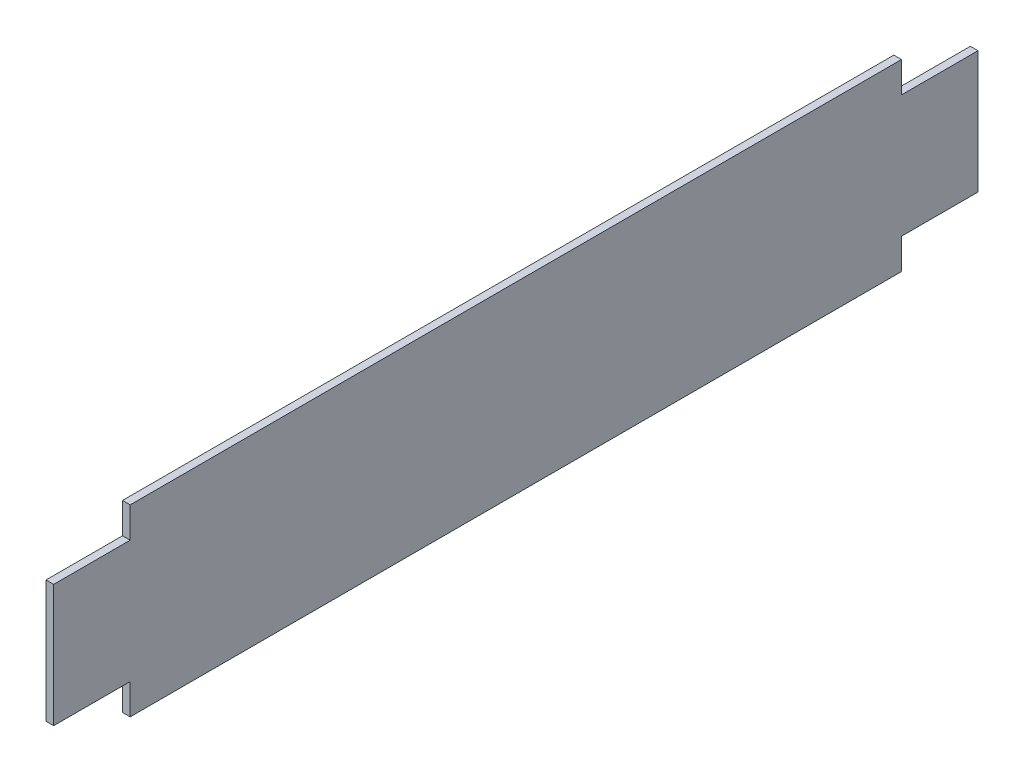
ISO-10303-21;
HEADER;
FILE_DESCRIPTION(('STEP AP214'),'2;1');
FILE_NAME('part.step','',(''),(''),'','','');
FILE_SCHEMA(('AUTOMOTIVE_DESIGN { 1 0 10303 214 1 1 1 1 }'));
ENDSEC;
DATA;
#1=APPLICATION_CONTEXT('core data for automotive mechanical design processes');
#2=APPLICATION_PROTOCOL_DEFINITION('international standard','automotive_design',2000,#1);
#3=PRODUCT_CONTEXT('',#1,'mechanical');
#4=PRODUCT('Part','Part','',(#3));
#5=PRODUCT_RELATED_PRODUCT_CATEGORY('part','',(#4));
#6=PRODUCT_DEFINITION_FORMATION('','',#4);
#7=PRODUCT_DEFINITION_CONTEXT('part definition',#1,'design');
#8=PRODUCT_DEFINITION('design','',#6,#7);
#9=PRODUCT_DEFINITION_SHAPE('','',#8);
#10=(LENGTH_UNIT() NAMED_UNIT(*) SI_UNIT(.MILLI.,.METRE.));
#11=(NAMED_UNIT(*) PLANE_ANGLE_UNIT() SI_UNIT($,.RADIAN.));
#12=(NAMED_UNIT(*) SI_UNIT($,.STERADIAN.) SOLID_ANGLE_UNIT());
#13=UNCERTAINTY_MEASURE_WITH_UNIT(LENGTH_MEASURE(1.E-05),#10,'distance_accuracy_value','');
#14=(GEOMETRIC_REPRESENTATION_CONTEXT(3) GLOBAL_UNCERTAINTY_ASSIGNED_CONTEXT((#13)) GLOBAL_UNIT_ASSIGNED_CONTEXT((#10,
#11,#12)) REPRESENTATION_CONTEXT('',''));
#15=CARTESIAN_POINT('',(0.,0.,0.));
#16=DIRECTION('',(0.,0.,1.));
#17=DIRECTION('',(1.,0.,0.));
#18=AXIS2_PLACEMENT_3D('',#15,#16,#17);
#19=CARTESIAN_POINT('',(0.,-25.4,191.77));
#20=DIRECTION('',(0.,1.,0.));
#21=DIRECTION('',(0.,0.,1.));
#22=AXIS2_PLACEMENT_3D('',#19,#20,#21);
#23=PLANE('',#22);
#24=DIRECTION('',(1.,0.,0.));
#25=VECTOR('',#24,1.);
#26=CARTESIAN_POINT('',(0.,-25.4,-160.02));
#27=LINE('',#26,#25);
#28=CARTESIAN_POINT('',(-1.5875,-25.4,-160.02));
#29=VERTEX_POINT('',#28);
#30=CARTESIAN_POINT('',(1.5875,-25.4,-160.02));
#31=VERTEX_POINT('',#30);
#32=EDGE_CURVE('E232',#29,#31,#27,.T.);
#33=ORIENTED_EDGE('',*,*,#32,.F.);
#34=DIRECTION('',(0.,0.,-1.));
#35=VECTOR('',#34,1.);
#36=CARTESIAN_POINT('',(-1.5875,-25.4,191.77));
#37=LINE('',#36,#35);
#38=CARTESIAN_POINT('',(-1.5875,-25.4,-191.77));
#39=VERTEX_POINT('',#38);
#40=EDGE_CURVE('E156',#29,#39,#37,.T.);
#41=ORIENTED_EDGE('',*,*,#40,.T.);
#42=DIRECTION('',(1.,0.,0.));
#43=VECTOR('',#42,1.);
#44=CARTESIAN_POINT('',(0.,-25.4,-191.77));
#45=LINE('',#44,#43);
#46=CARTESIAN_POINT('',(1.5875,-25.4,-191.77));
#47=VERTEX_POINT('',#46);
#48=EDGE_CURVE('E193',#39,#47,#45,.T.);
#49=ORIENTED_EDGE('',*,*,#48,.T.);
#50=DIRECTION('',(0.,0.,-1.));
#51=VECTOR('',#50,1.);
#52=CARTESIAN_POINT('',(1.5875,-25.4,191.77));
#53=LINE('',#52,#51);
#54=EDGE_CURVE('E180',#31,#47,#53,.T.);
#55=ORIENTED_EDGE('',*,*,#54,.F.);
#56=EDGE_LOOP('',(#33,#41,#49,#55));
#57=FACE_BOUND('',#56,.T.);
#58=ADVANCED_FACE('F42',(#57),#23,.F.);
#59=CARTESIAN_POINT('',(0.,25.4,191.77));
#60=DIRECTION('',(0.,1.,0.));
#61=DIRECTION('',(0.,0.,1.));
#62=AXIS2_PLACEMENT_3D('',#59,#60,#61);
#63=PLANE('',#62);
#64=DIRECTION('',(0.,0.,-1.));
#65=VECTOR('',#64,1.);
#66=CARTESIAN_POINT('',(-1.5875,25.4,191.77));
#67=LINE('',#66,#65);
#68=CARTESIAN_POINT('',(-1.5875,25.4,-160.02));
#69=VERTEX_POINT('',#68);
#70=CARTESIAN_POINT('',(-1.5875,25.4,-191.77));
#71=VERTEX_POINT('',#70);
#72=EDGE_CURVE('E155',#69,#71,#67,.T.);
#73=ORIENTED_EDGE('',*,*,#72,.F.);
#74=DIRECTION('',(1.,0.,0.));
#75=VECTOR('',#74,1.);
#76=CARTESIAN_POINT('',(0.,25.4,-160.02));
#77=LINE('',#76,#75);
#78=CARTESIAN_POINT('',(1.5875,25.4,-160.02));
#79=VERTEX_POINT('',#78);
#80=EDGE_CURVE('E66',#69,#79,#77,.T.);
#81=ORIENTED_EDGE('',*,*,#80,.T.);
#82=DIRECTION('',(0.,0.,-1.));
#83=VECTOR('',#82,1.);
#84=CARTESIAN_POINT('',(1.5875,25.4,191.77));
#85=LINE('',#84,#83);
#86=CARTESIAN_POINT('',(1.5875,25.4,-191.77));
#87=VERTEX_POINT('',#86);
#88=EDGE_CURVE('E51',#79,#87,#85,.T.);
#89=ORIENTED_EDGE('',*,*,#88,.T.);
#90=DIRECTION('',(1.,0.,0.));
#91=VECTOR('',#90,1.);
#92=CARTESIAN_POINT('',(0.,25.4,-191.77));
#93=LINE('',#92,#91);
#94=EDGE_CURVE('E173',#71,#87,#93,.T.);
#95=ORIENTED_EDGE('',*,*,#94,.F.);
#96=EDGE_LOOP('',(#73,#81,#89,#95));
#97=FACE_BOUND('',#96,.T.);
#98=ADVANCED_FACE('F171',(#97),#63,.T.);
#99=CARTESIAN_POINT('',(1.5875,0.,191.77));
#100=DIRECTION('',(1.,0.,0.));
#101=DIRECTION('',(0.,1.,0.));
#102=AXIS2_PLACEMENT_3D('',#99,#100,#101);
#103=PLANE('',#102);
#104=DIRECTION('',(0.,-1.,0.));
#105=VECTOR('',#104,1.);
#106=CARTESIAN_POINT('',(1.5875,0.,-191.77));
#107=LINE('',#106,#105);
#108=EDGE_CURVE('E178',#87,#47,#107,.T.);
#109=ORIENTED_EDGE('',*,*,#108,.F.);
#110=ORIENTED_EDGE('',*,*,#88,.F.);
#111=DIRECTION('',(0.,-1.,0.));
#112=VECTOR('',#111,1.);
#113=CARTESIAN_POINT('',(1.5875,0.,-160.02));
#114=LINE('',#113,#112);
#115=CARTESIAN_POINT('',(1.5875,38.1,-160.02));
#116=VERTEX_POINT('',#115);
#117=EDGE_CURVE('E242',#116,#79,#114,.T.);
#118=ORIENTED_EDGE('',*,*,#117,.F.);
#119=DIRECTION('',(0.,0.,-1.));
#120=VECTOR('',#119,1.);
#121=CARTESIAN_POINT('',(1.5875,38.1,160.02));
#122=LINE('',#121,#120);
#123=CARTESIAN_POINT('',(1.5875,38.1,160.02));
#124=VERTEX_POINT('',#123);
#125=EDGE_CURVE('E185',#124,#116,#122,.T.);
#126=ORIENTED_EDGE('',*,*,#125,.F.);
#127=DIRECTION('',(0.,-1.,0.));
#128=VECTOR('',#127,1.);
#129=CARTESIAN_POINT('',(1.5875,0.,160.02));
#130=LINE('',#129,#128);
#131=CARTESIAN_POINT('',(1.5875,25.4,160.02));
#132=VERTEX_POINT('',#131);
#133=EDGE_CURVE('E243',#124,#132,#130,.T.);
#134=ORIENTED_EDGE('',*,*,#133,.T.);
#135=CARTESIAN_POINT('',(1.5875,25.4,191.77));
#136=VERTEX_POINT('',#135);
#137=EDGE_CURVE('E11',#136,#132,#85,.T.);
#138=ORIENTED_EDGE('',*,*,#137,.F.);
#139=DIRECTION('',(0.,-1.,0.));
#140=VECTOR('',#139,1.);
#141=CARTESIAN_POINT('',(1.5875,0.,191.77));
#142=LINE('',#141,#140);
#143=CARTESIAN_POINT('',(1.5875,-25.4,191.77));
#144=VERTEX_POINT('',#143);
#145=EDGE_CURVE('E197',#136,#144,#142,.T.);
#146=ORIENTED_EDGE('',*,*,#145,.T.);
#147=CARTESIAN_POINT('',(1.5875,-25.4,160.02));
#148=VERTEX_POINT('',#147);
#149=EDGE_CURVE('E161',#144,#148,#53,.T.);
#150=ORIENTED_EDGE('',*,*,#149,.T.);
#151=DIRECTION('',(0.,-1.,0.));
#152=VECTOR('',#151,1.);
#153=CARTESIAN_POINT('',(1.5875,0.,160.02));
#154=LINE('',#153,#152);
#155=CARTESIAN_POINT('',(1.58750000000001,-38.1,160.02));
#156=VERTEX_POINT('',#155);
#157=EDGE_CURVE('E58',#148,#156,#154,.T.);
#158=ORIENTED_EDGE('',*,*,#157,.T.);
#159=DIRECTION('',(0.,0.,-1.));
#160=VECTOR('',#159,1.);
#161=CARTESIAN_POINT('',(1.58750000000001,-38.1,160.02));
#162=LINE('',#161,#160);
#163=CARTESIAN_POINT('',(1.58750000000001,-38.1,-160.02));
#164=VERTEX_POINT('',#163);
#165=EDGE_CURVE('E217',#156,#164,#162,.T.);
#166=ORIENTED_EDGE('',*,*,#165,.T.);
#167=DIRECTION('',(0.,-1.,0.));
#168=VECTOR('',#167,1.);
#169=CARTESIAN_POINT('',(1.5875,0.,-160.02));
#170=LINE('',#169,#168);
#171=EDGE_CURVE('E228',#31,#164,#170,.T.);
#172=ORIENTED_EDGE('',*,*,#171,.F.);
#173=ORIENTED_EDGE('',*,*,#54,.T.);
#174=EDGE_LOOP('',(#109,#110,#118,#126,#134,#138,#146,#150,#158,#166,#172,#173));
#175=FACE_BOUND('',#174,.T.);
#176=ADVANCED_FACE('F44',(#175),#103,.T.);
#177=DIRECTION('',(1.,0.,0.));
#178=VECTOR('',#177,1.);
#179=CARTESIAN_POINT('',(0.,25.4,160.02));
#180=LINE('',#179,#178);
#181=CARTESIAN_POINT('',(-1.5875,25.4,160.02));
#182=VERTEX_POINT('',#181);
#183=EDGE_CURVE('E254',#182,#132,#180,.T.);
#184=ORIENTED_EDGE('',*,*,#183,.F.);
#185=CARTESIAN_POINT('',(-1.5875,25.4,191.77));
#186=VERTEX_POINT('',#185);
#187=EDGE_CURVE('E160',#186,#182,#67,.T.);
#188=ORIENTED_EDGE('',*,*,#187,.F.);
#189=DIRECTION('',(1.,0.,0.));
#190=VECTOR('',#189,1.);
#191=CARTESIAN_POINT('',(0.,25.4,191.77));
#192=LINE('',#191,#190);
#193=EDGE_CURVE('E201',#186,#136,#192,.T.);
#194=ORIENTED_EDGE('',*,*,#193,.T.);
#195=ORIENTED_EDGE('',*,*,#137,.T.);
#196=EDGE_LOOP('',(#184,#188,#194,#195));
#197=FACE_BOUND('',#196,.T.);
#198=ADVANCED_FACE('F303',(#197),#63,.T.);
#199=CARTESIAN_POINT('',(-1.5875,0.,191.77));
#200=DIRECTION('',(1.,0.,0.));
#201=DIRECTION('',(0.,1.,0.));
#202=AXIS2_PLACEMENT_3D('',#199,#200,#201);
#203=PLANE('',#202);
#204=DIRECTION('',(0.,-1.,0.));
#205=VECTOR('',#204,1.);
#206=CARTESIAN_POINT('',(-1.5875,0.,-191.77));
#207=LINE('',#206,#205);
#208=EDGE_CURVE('E189',#71,#39,#207,.T.);
#209=ORIENTED_EDGE('',*,*,#208,.T.);
#210=ORIENTED_EDGE('',*,*,#40,.F.);
#211=DIRECTION('',(0.,-1.,0.));
#212=VECTOR('',#211,1.);
#213=CARTESIAN_POINT('',(-1.5875,0.,-160.02));
#214=LINE('',#213,#212);
#215=CARTESIAN_POINT('',(-1.5875,-38.1,-160.02));
#216=VERTEX_POINT('',#215);
#217=EDGE_CURVE('E223',#29,#216,#214,.T.);
#218=ORIENTED_EDGE('',*,*,#217,.T.);
#219=DIRECTION('',(0.,0.,-1.));
#220=VECTOR('',#219,1.);
#221=CARTESIAN_POINT('',(-1.5875,-38.1,160.02));
#222=LINE('',#221,#220);
#223=CARTESIAN_POINT('',(-1.5875,-38.1,160.02));
#224=VERTEX_POINT('',#223);
#225=EDGE_CURVE('E140',#224,#216,#222,.T.);
#226=ORIENTED_EDGE('',*,*,#225,.F.);
#227=DIRECTION('',(0.,-1.,0.));
#228=VECTOR('',#227,1.);
#229=CARTESIAN_POINT('',(-1.5875,0.,160.02));
#230=LINE('',#229,#228);
#231=CARTESIAN_POINT('',(-1.5875,-25.4,160.02));
#232=VERTEX_POINT('',#231);
#233=EDGE_CURVE('E132',#232,#224,#230,.T.);
#234=ORIENTED_EDGE('',*,*,#233,.F.);
#235=CARTESIAN_POINT('',(-1.5875,-25.4,191.77));
#236=VERTEX_POINT('',#235);
#237=EDGE_CURVE('E137',#236,#232,#37,.T.);
#238=ORIENTED_EDGE('',*,*,#237,.F.);
#239=DIRECTION('',(0.,-1.,0.));
#240=VECTOR('',#239,1.);
#241=CARTESIAN_POINT('',(-1.5875,0.,191.77));
#242=LINE('',#241,#240);
#243=EDGE_CURVE('E206',#186,#236,#242,.T.);
#244=ORIENTED_EDGE('',*,*,#243,.F.);
#245=ORIENTED_EDGE('',*,*,#187,.T.);
#246=DIRECTION('',(0.,-1.,0.));
#247=VECTOR('',#246,1.);
#248=CARTESIAN_POINT('',(-1.5875,0.,160.02));
#249=LINE('',#248,#247);
#250=CARTESIAN_POINT('',(-1.58750000000001,38.1,160.02));
#251=VERTEX_POINT('',#250);
#252=EDGE_CURVE('E251',#251,#182,#249,.T.);
#253=ORIENTED_EDGE('',*,*,#252,.F.);
#254=DIRECTION('',(0.,0.,-1.));
#255=VECTOR('',#254,1.);
#256=CARTESIAN_POINT('',(-1.58750000000001,38.1,160.02));
#257=LINE('',#256,#255);
#258=CARTESIAN_POINT('',(-1.58750000000001,38.1,-160.02));
#259=VERTEX_POINT('',#258);
#260=EDGE_CURVE('E258',#251,#259,#257,.T.);
#261=ORIENTED_EDGE('',*,*,#260,.T.);
#262=DIRECTION('',(0.,-1.,0.));
#263=VECTOR('',#262,1.);
#264=CARTESIAN_POINT('',(-1.5875,0.,-160.02));
#265=LINE('',#264,#263);
#266=EDGE_CURVE('E265',#259,#69,#265,.T.);
#267=ORIENTED_EDGE('',*,*,#266,.T.);
#268=ORIENTED_EDGE('',*,*,#72,.T.);
#269=EDGE_LOOP('',(#209,#210,#218,#226,#234,#238,#244,#245,#253,#261,#267,#268));
#270=FACE_BOUND('',#269,.T.);
#271=ADVANCED_FACE('F134',(#270),#203,.F.);
#272=ORIENTED_EDGE('',*,*,#237,.T.);
#273=DIRECTION('',(1.,0.,0.));
#274=VECTOR('',#273,1.);
#275=CARTESIAN_POINT('',(0.,-25.4,160.02));
#276=LINE('',#275,#274);
#277=EDGE_CURVE('E144',#232,#148,#276,.T.);
#278=ORIENTED_EDGE('',*,*,#277,.T.);
#279=ORIENTED_EDGE('',*,*,#149,.F.);
#280=DIRECTION('',(1.,0.,0.));
#281=VECTOR('',#280,1.);
#282=CARTESIAN_POINT('',(0.,-25.4,191.77));
#283=LINE('',#282,#281);
#284=EDGE_CURVE('E153',#236,#144,#283,.T.);
#285=ORIENTED_EDGE('',*,*,#284,.F.);
#286=EDGE_LOOP('',(#272,#278,#279,#285));
#287=FACE_BOUND('',#286,.T.);
#288=ADVANCED_FACE('F152',(#287),#23,.F.);
#289=CARTESIAN_POINT('',(0.,0.,191.77));
#290=DIRECTION('',(0.,0.,1.));
#291=DIRECTION('',(1.,0.,0.));
#292=AXIS2_PLACEMENT_3D('',#289,#290,#291);
#293=PLANE('',#292);
#294=ORIENTED_EDGE('',*,*,#145,.F.);
#295=ORIENTED_EDGE('',*,*,#193,.F.);
#296=ORIENTED_EDGE('',*,*,#243,.T.);
#297=ORIENTED_EDGE('',*,*,#284,.T.);
#298=EDGE_LOOP('',(#294,#295,#296,#297));
#299=FACE_BOUND('',#298,.T.);
#300=ADVANCED_FACE('F307',(#299),#293,.T.);
#301=CARTESIAN_POINT('',(0.,0.,-191.77));
#302=DIRECTION('',(0.,0.,1.));
#303=DIRECTION('',(1.,0.,0.));
#304=AXIS2_PLACEMENT_3D('',#301,#302,#303);
#305=PLANE('',#304);
#306=ORIENTED_EDGE('',*,*,#108,.T.);
#307=ORIENTED_EDGE('',*,*,#48,.F.);
#308=ORIENTED_EDGE('',*,*,#208,.F.);
#309=ORIENTED_EDGE('',*,*,#94,.T.);
#310=EDGE_LOOP('',(#306,#307,#308,#309));
#311=FACE_BOUND('',#310,.T.);
#312=ADVANCED_FACE('F188',(#311),#305,.F.);
#313=CARTESIAN_POINT('',(0.,38.1,160.02));
#314=DIRECTION('',(0.,1.,0.));
#315=DIRECTION('',(0.,0.,1.));
#316=AXIS2_PLACEMENT_3D('',#313,#314,#315);
#317=PLANE('',#316);
#318=DIRECTION('',(1.,0.,0.));
#319=VECTOR('',#318,1.);
#320=CARTESIAN_POINT('',(0.,38.1,-160.02));
#321=LINE('',#320,#319);
#322=EDGE_CURVE('E261',#259,#116,#321,.T.);
#323=ORIENTED_EDGE('',*,*,#322,.F.);
#324=ORIENTED_EDGE('',*,*,#260,.F.);
#325=DIRECTION('',(1.,0.,0.));
#326=VECTOR('',#325,1.);
#327=CARTESIAN_POINT('',(0.,38.1,160.02));
#328=LINE('',#327,#326);
#329=EDGE_CURVE('E247',#251,#124,#328,.T.);
#330=ORIENTED_EDGE('',*,*,#329,.T.);
#331=ORIENTED_EDGE('',*,*,#125,.T.);
#332=EDGE_LOOP('',(#323,#324,#330,#331));
#333=FACE_BOUND('',#332,.T.);
#334=ADVANCED_FACE('F275',(#333),#317,.T.);
#335=CARTESIAN_POINT('',(0.,0.,160.02));
#336=DIRECTION('',(0.,0.,1.));
#337=DIRECTION('',(1.,0.,0.));
#338=AXIS2_PLACEMENT_3D('',#335,#336,#337);
#339=PLANE('',#338);
#340=ORIENTED_EDGE('',*,*,#133,.F.);
#341=ORIENTED_EDGE('',*,*,#329,.F.);
#342=ORIENTED_EDGE('',*,*,#252,.T.);
#343=ORIENTED_EDGE('',*,*,#183,.T.);
#344=EDGE_LOOP('',(#340,#341,#342,#343));
#345=FACE_BOUND('',#344,.T.);
#346=ADVANCED_FACE('F294',(#345),#339,.T.);
#347=CARTESIAN_POINT('',(0.,0.,-160.02));
#348=DIRECTION('',(0.,0.,1.));
#349=DIRECTION('',(1.,0.,0.));
#350=AXIS2_PLACEMENT_3D('',#347,#348,#349);
#351=PLANE('',#350);
#352=ORIENTED_EDGE('',*,*,#117,.T.);
#353=ORIENTED_EDGE('',*,*,#80,.F.);
#354=ORIENTED_EDGE('',*,*,#266,.F.);
#355=ORIENTED_EDGE('',*,*,#322,.T.);
#356=EDGE_LOOP('',(#352,#353,#354,#355));
#357=FACE_BOUND('',#356,.T.);
#358=ADVANCED_FACE('F279',(#357),#351,.F.);
#359=CARTESIAN_POINT('',(0.,-38.1,160.02));
#360=DIRECTION('',(0.,1.,0.));
#361=DIRECTION('',(0.,0.,1.));
#362=AXIS2_PLACEMENT_3D('',#359,#360,#361);
#363=PLANE('',#362);
#364=DIRECTION('',(1.,0.,0.));
#365=VECTOR('',#364,1.);
#366=CARTESIAN_POINT('',(0.,-38.1,-160.02));
#367=LINE('',#366,#365);
#368=EDGE_CURVE('E220',#216,#164,#367,.T.);
#369=ORIENTED_EDGE('',*,*,#368,.T.);
#370=ORIENTED_EDGE('',*,*,#165,.F.);
#371=DIRECTION('',(1.,0.,0.));
#372=VECTOR('',#371,1.);
#373=CARTESIAN_POINT('',(0.,-38.1,160.02));
#374=LINE('',#373,#372);
#375=EDGE_CURVE('E143',#224,#156,#374,.T.);
#376=ORIENTED_EDGE('',*,*,#375,.F.);
#377=ORIENTED_EDGE('',*,*,#225,.T.);
#378=EDGE_LOOP('',(#369,#370,#376,#377));
#379=FACE_BOUND('',#378,.T.);
#380=ADVANCED_FACE('F286',(#379),#363,.F.);
#381=CARTESIAN_POINT('',(0.,0.,160.02));
#382=DIRECTION('',(0.,0.,1.));
#383=DIRECTION('',(1.,0.,0.));
#384=AXIS2_PLACEMENT_3D('',#381,#382,#383);
#385=PLANE('',#384);
#386=ORIENTED_EDGE('',*,*,#157,.F.);
#387=ORIENTED_EDGE('',*,*,#277,.F.);
#388=ORIENTED_EDGE('',*,*,#233,.T.);
#389=ORIENTED_EDGE('',*,*,#375,.T.);
#390=EDGE_LOOP('',(#386,#387,#388,#389));
#391=FACE_BOUND('',#390,.T.);
#392=ADVANCED_FACE('F146',(#391),#385,.T.);
#393=CARTESIAN_POINT('',(0.,0.,-160.02));
#394=DIRECTION('',(0.,0.,1.));
#395=DIRECTION('',(1.,0.,0.));
#396=AXIS2_PLACEMENT_3D('',#393,#394,#395);
#397=PLANE('',#396);
#398=ORIENTED_EDGE('',*,*,#171,.T.);
#399=ORIENTED_EDGE('',*,*,#368,.F.);
#400=ORIENTED_EDGE('',*,*,#217,.F.);
#401=ORIENTED_EDGE('',*,*,#32,.T.);
#402=EDGE_LOOP('',(#398,#399,#400,#401));
#403=FACE_BOUND('',#402,.T.);
#404=ADVANCED_FACE('F283',(#403),#397,.F.);
#405=CLOSED_SHELL('',(#58,#98,#176,#198,#271,#288,#300,#312,#334,#346,#358,#380,#392,#404));
#406=MANIFOLD_SOLID_BREP('B2',#405);
#407=ADVANCED_BREP_SHAPE_REPRESENTATION('',(#18,#406),#14);
#408=SHAPE_DEFINITION_REPRESENTATION(#9,#407);
ENDSEC;
END-ISO-10303-21;
